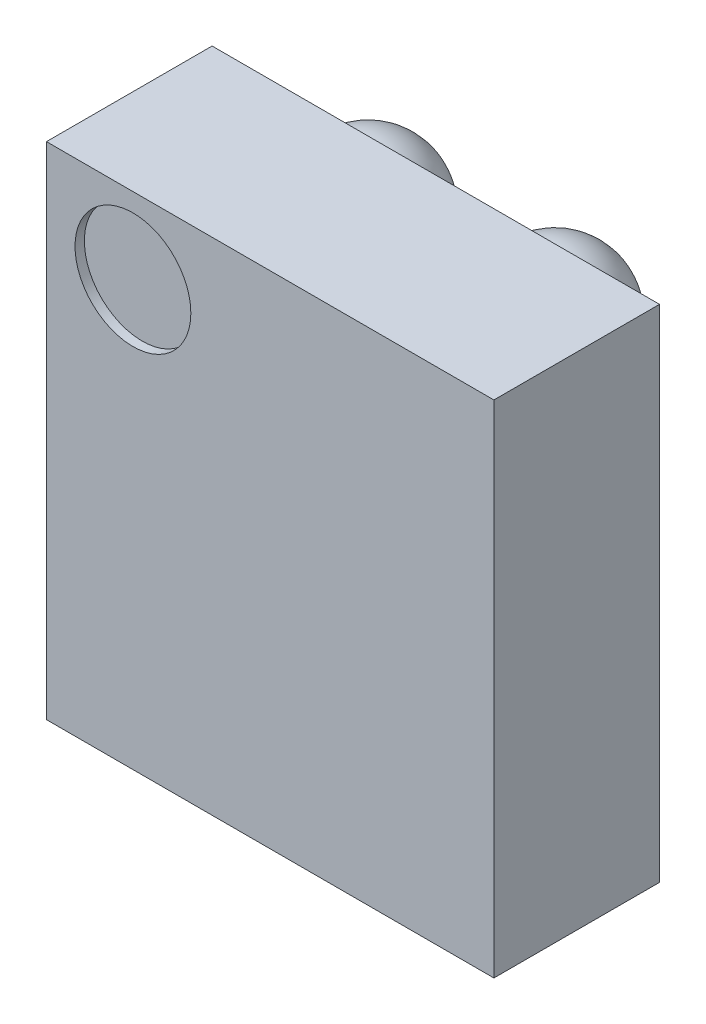
ISO-10303-21;
HEADER;
FILE_DESCRIPTION(('STEP AP214'),'2;1');
FILE_NAME('part.step','',(''),(''),'','','');
FILE_SCHEMA(('AUTOMOTIVE_DESIGN { 1 0 10303 214 1 1 1 1 }'));
ENDSEC;
DATA;
#1=APPLICATION_CONTEXT('core data for automotive mechanical design processes');
#2=APPLICATION_PROTOCOL_DEFINITION('international standard','automotive_design',2000,#1);
#3=PRODUCT_CONTEXT('',#1,'mechanical');
#4=PRODUCT('Part','Part','',(#3));
#5=PRODUCT_RELATED_PRODUCT_CATEGORY('part','',(#4));
#6=PRODUCT_DEFINITION_FORMATION('','',#4);
#7=PRODUCT_DEFINITION_CONTEXT('part definition',#1,'design');
#8=PRODUCT_DEFINITION('design','',#6,#7);
#9=PRODUCT_DEFINITION_SHAPE('','',#8);
#10=(LENGTH_UNIT() NAMED_UNIT(*) SI_UNIT(.MILLI.,.METRE.));
#11=(NAMED_UNIT(*) PLANE_ANGLE_UNIT() SI_UNIT($,.RADIAN.));
#12=(NAMED_UNIT(*) SI_UNIT($,.STERADIAN.) SOLID_ANGLE_UNIT());
#13=UNCERTAINTY_MEASURE_WITH_UNIT(LENGTH_MEASURE(1.E-05),#10,'distance_accuracy_value','');
#14=(GEOMETRIC_REPRESENTATION_CONTEXT(3) GLOBAL_UNCERTAINTY_ASSIGNED_CONTEXT((#13)) GLOBAL_UNIT_ASSIGNED_CONTEXT((#10,
#11,#12)) REPRESENTATION_CONTEXT('',''));
#15=CARTESIAN_POINT('',(0.,0.,0.));
#16=DIRECTION('',(0.,0.,1.));
#17=DIRECTION('',(1.,0.,0.));
#18=AXIS2_PLACEMENT_3D('',#15,#16,#17);
#19=CARTESIAN_POINT('',(-0.2,-0.3465,0.135));
#20=DIRECTION('',(0.,0.,-1.));
#21=DIRECTION('',(1.,0.,0.));
#22=AXIS2_PLACEMENT_3D('',#19,#20,#21);
#23=SPHERICAL_SURFACE('',#22,0.135);
#24=CARTESIAN_POINT('',(-0.2,-0.3465,0.19));
#25=DIRECTION('',(0.,0.,-1.));
#26=DIRECTION('',(-1.,0.,0.));
#27=AXIS2_PLACEMENT_3D('',#24,#25,#26);
#28=CIRCLE('',#27,0.12328828005938);
#29=CARTESIAN_POINT('',(-0.32328828005938,-0.3465,0.19));
#30=VERTEX_POINT('',#29);
#31=EDGE_CURVE('E11',#30,#30,#28,.F.);
#32=ORIENTED_EDGE('',*,*,#31,.F.);
#33=EDGE_LOOP('',(#32));
#34=FACE_BOUND('',#33,.T.);
#35=ADVANCED_FACE('F43',(#34),#23,.T.);
#36=CARTESIAN_POINT('',(-0.2,0.3465,0.135));
#37=DIRECTION('',(0.,0.,-1.));
#38=DIRECTION('',(1.,0.,0.));
#39=AXIS2_PLACEMENT_3D('',#36,#37,#38);
#40=SPHERICAL_SURFACE('',#39,0.135);
#41=CARTESIAN_POINT('',(-0.2,0.3465,0.19));
#42=DIRECTION('',(0.,0.,-1.));
#43=DIRECTION('',(-1.,0.,0.));
#44=AXIS2_PLACEMENT_3D('',#41,#42,#43);
#45=CIRCLE('',#44,0.12328828005938);
#46=CARTESIAN_POINT('',(-0.32328828005938,0.3465,0.19));
#47=VERTEX_POINT('',#46);
#48=EDGE_CURVE('E52',#47,#47,#45,.F.);
#49=ORIENTED_EDGE('',*,*,#48,.F.);
#50=EDGE_LOOP('',(#49));
#51=FACE_BOUND('',#50,.T.);
#52=ADVANCED_FACE('F155',(#51),#40,.T.);
#53=CARTESIAN_POINT('',(0.2,-0.3465,0.135));
#54=DIRECTION('',(0.,0.,-1.));
#55=DIRECTION('',(1.,0.,0.));
#56=AXIS2_PLACEMENT_3D('',#53,#54,#55);
#57=SPHERICAL_SURFACE('',#56,0.135);
#58=CARTESIAN_POINT('',(0.2,-0.3465,0.19));
#59=DIRECTION('',(0.,0.,-1.));
#60=DIRECTION('',(-1.,0.,0.));
#61=AXIS2_PLACEMENT_3D('',#58,#59,#60);
#62=CIRCLE('',#61,0.12328828005938);
#63=CARTESIAN_POINT('',(0.0767117199406205,-0.3465,0.19));
#64=VERTEX_POINT('',#63);
#65=EDGE_CURVE('E133',#64,#64,#62,.F.);
#66=ORIENTED_EDGE('',*,*,#65,.F.);
#67=EDGE_LOOP('',(#66));
#68=FACE_BOUND('',#67,.T.);
#69=ADVANCED_FACE('F157',(#68),#57,.T.);
#70=CARTESIAN_POINT('',(-0.4795,-0.5365,0.545));
#71=DIRECTION('',(-1.,0.,0.));
#72=DIRECTION('',(0.,0.,1.));
#73=AXIS2_PLACEMENT_3D('',#70,#71,#72);
#74=PLANE('',#73);
#75=DIRECTION('',(0.,1.,0.));
#76=VECTOR('',#75,1.);
#77=CARTESIAN_POINT('',(-0.4795,-0.5365,0.19));
#78=LINE('',#77,#76);
#79=CARTESIAN_POINT('',(-0.4795,-0.5365,0.19));
#80=VERTEX_POINT('',#79);
#81=CARTESIAN_POINT('',(-0.4795,0.5365,0.19));
#82=VERTEX_POINT('',#81);
#83=EDGE_CURVE('E120',#80,#82,#78,.T.);
#84=ORIENTED_EDGE('',*,*,#83,.F.);
#85=DIRECTION('',(0.,0.,-1.));
#86=VECTOR('',#85,1.);
#87=CARTESIAN_POINT('',(-0.4795,-0.5365,0.545));
#88=LINE('',#87,#86);
#89=CARTESIAN_POINT('',(-0.4795,-0.5365,0.545));
#90=VERTEX_POINT('',#89);
#91=EDGE_CURVE('E60',#90,#80,#88,.T.);
#92=ORIENTED_EDGE('',*,*,#91,.F.);
#93=DIRECTION('',(0.,1.,0.));
#94=VECTOR('',#93,1.);
#95=CARTESIAN_POINT('',(-0.4795,-0.5365,0.545));
#96=LINE('',#95,#94);
#97=CARTESIAN_POINT('',(-0.4795,0.5365,0.545));
#98=VERTEX_POINT('',#97);
#99=EDGE_CURVE('E110',#90,#98,#96,.T.);
#100=ORIENTED_EDGE('',*,*,#99,.T.);
#101=DIRECTION('',(0.,0.,-1.));
#102=VECTOR('',#101,1.);
#103=CARTESIAN_POINT('',(-0.4795,0.5365,0.545));
#104=LINE('',#103,#102);
#105=EDGE_CURVE('E85',#98,#82,#104,.T.);
#106=ORIENTED_EDGE('',*,*,#105,.T.);
#107=EDGE_LOOP('',(#84,#92,#100,#106));
#108=FACE_BOUND('',#107,.T.);
#109=ADVANCED_FACE('F162',(#108),#74,.T.);
#110=CARTESIAN_POINT('',(-0.4795,-0.5365,0.545));
#111=DIRECTION('',(0.,1.,0.));
#112=DIRECTION('',(0.,0.,1.));
#113=AXIS2_PLACEMENT_3D('',#110,#111,#112);
#114=PLANE('',#113);
#115=DIRECTION('',(1.,0.,0.));
#116=VECTOR('',#115,1.);
#117=CARTESIAN_POINT('',(-0.4795,-0.5365,0.19));
#118=LINE('',#117,#116);
#119=CARTESIAN_POINT('',(0.4795,-0.5365,0.19));
#120=VERTEX_POINT('',#119);
#121=EDGE_CURVE('E77',#80,#120,#118,.T.);
#122=ORIENTED_EDGE('',*,*,#121,.T.);
#123=DIRECTION('',(0.,0.,-1.));
#124=VECTOR('',#123,1.);
#125=CARTESIAN_POINT('',(0.4795,-0.5365,0.545));
#126=LINE('',#125,#124);
#127=CARTESIAN_POINT('',(0.4795,-0.5365,0.545));
#128=VERTEX_POINT('',#127);
#129=EDGE_CURVE('E106',#128,#120,#126,.T.);
#130=ORIENTED_EDGE('',*,*,#129,.F.);
#131=DIRECTION('',(1.,0.,0.));
#132=VECTOR('',#131,1.);
#133=CARTESIAN_POINT('',(-0.4795,-0.5365,0.545));
#134=LINE('',#133,#132);
#135=EDGE_CURVE('E95',#90,#128,#134,.T.);
#136=ORIENTED_EDGE('',*,*,#135,.F.);
#137=ORIENTED_EDGE('',*,*,#91,.T.);
#138=EDGE_LOOP('',(#122,#130,#136,#137));
#139=FACE_BOUND('',#138,.T.);
#140=ADVANCED_FACE('F169',(#139),#114,.F.);
#141=CARTESIAN_POINT('',(0.4795,-0.5365,0.545));
#142=DIRECTION('',(-1.,0.,0.));
#143=DIRECTION('',(0.,0.,1.));
#144=AXIS2_PLACEMENT_3D('',#141,#142,#143);
#145=PLANE('',#144);
#146=DIRECTION('',(0.,1.,0.));
#147=VECTOR('',#146,1.);
#148=CARTESIAN_POINT('',(0.4795,-0.5365,0.19));
#149=LINE('',#148,#147);
#150=CARTESIAN_POINT('',(0.4795,0.5365,0.19));
#151=VERTEX_POINT('',#150);
#152=EDGE_CURVE('E103',#120,#151,#149,.T.);
#153=ORIENTED_EDGE('',*,*,#152,.T.);
#154=DIRECTION('',(0.,0.,-1.));
#155=VECTOR('',#154,1.);
#156=CARTESIAN_POINT('',(0.4795,0.5365,0.545));
#157=LINE('',#156,#155);
#158=CARTESIAN_POINT('',(0.4795,0.5365,0.545));
#159=VERTEX_POINT('',#158);
#160=EDGE_CURVE('E100',#159,#151,#157,.T.);
#161=ORIENTED_EDGE('',*,*,#160,.F.);
#162=DIRECTION('',(0.,1.,0.));
#163=VECTOR('',#162,1.);
#164=CARTESIAN_POINT('',(0.4795,-0.5365,0.545));
#165=LINE('',#164,#163);
#166=EDGE_CURVE('E90',#128,#159,#165,.T.);
#167=ORIENTED_EDGE('',*,*,#166,.F.);
#168=ORIENTED_EDGE('',*,*,#129,.T.);
#169=EDGE_LOOP('',(#153,#161,#167,#168));
#170=FACE_BOUND('',#169,.T.);
#171=ADVANCED_FACE('F101',(#170),#145,.F.);
#172=CARTESIAN_POINT('',(-0.4795,0.5365,0.545));
#173=DIRECTION('',(0.,1.,0.));
#174=DIRECTION('',(0.,0.,1.));
#175=AXIS2_PLACEMENT_3D('',#172,#173,#174);
#176=PLANE('',#175);
#177=DIRECTION('',(1.,0.,0.));
#178=VECTOR('',#177,1.);
#179=CARTESIAN_POINT('',(-0.4795,0.5365,0.19));
#180=LINE('',#179,#178);
#181=EDGE_CURVE('E124',#82,#151,#180,.T.);
#182=ORIENTED_EDGE('',*,*,#181,.F.);
#183=ORIENTED_EDGE('',*,*,#105,.F.);
#184=DIRECTION('',(1.,0.,0.));
#185=VECTOR('',#184,1.);
#186=CARTESIAN_POINT('',(-0.4795,0.5365,0.545));
#187=LINE('',#186,#185);
#188=EDGE_CURVE('E94',#98,#159,#187,.T.);
#189=ORIENTED_EDGE('',*,*,#188,.T.);
#190=ORIENTED_EDGE('',*,*,#160,.T.);
#191=EDGE_LOOP('',(#182,#183,#189,#190));
#192=FACE_BOUND('',#191,.T.);
#193=ADVANCED_FACE('F108',(#192),#176,.T.);
#194=CARTESIAN_POINT('',(0.,0.,0.545));
#195=DIRECTION('',(0.,0.,-1.));
#196=DIRECTION('',(-1.,0.,0.));
#197=AXIS2_PLACEMENT_3D('',#194,#195,#196);
#198=PLANE('',#197);
#199=CARTESIAN_POINT('',(-0.294168663259597,0.372880621938521,0.545));
#200=DIRECTION('',(0.,0.,1.));
#201=DIRECTION('',(1.,0.,0.));
#202=AXIS2_PLACEMENT_3D('',#199,#200,#201);
#203=CIRCLE('',#202,0.124110003592202);
#204=CARTESIAN_POINT('',(-0.170058659667395,0.372880621938521,0.545));
#205=VERTEX_POINT('',#204);
#206=EDGE_CURVE('E201',#205,#205,#203,.T.);
#207=ORIENTED_EDGE('',*,*,#206,.F.);
#208=EDGE_LOOP('',(#207));
#209=FACE_BOUND('',#208,.T.);
#210=ORIENTED_EDGE('',*,*,#99,.F.);
#211=ORIENTED_EDGE('',*,*,#135,.T.);
#212=ORIENTED_EDGE('',*,*,#166,.T.);
#213=ORIENTED_EDGE('',*,*,#188,.F.);
#214=EDGE_LOOP('',(#210,#211,#212,#213));
#215=FACE_BOUND('',#214,.T.);
#216=ADVANCED_FACE('F93',(#209,#215),#198,.F.);
#217=CARTESIAN_POINT('',(0.,0.,0.19));
#218=DIRECTION('',(0.,0.,-1.));
#219=DIRECTION('',(-1.,0.,0.));
#220=AXIS2_PLACEMENT_3D('',#217,#218,#219);
#221=PLANE('',#220);
#222=ORIENTED_EDGE('',*,*,#31,.T.);
#223=EDGE_LOOP('',(#222));
#224=FACE_BOUND('',#223,.T.);
#225=ORIENTED_EDGE('',*,*,#48,.T.);
#226=EDGE_LOOP('',(#225));
#227=FACE_BOUND('',#226,.T.);
#228=ORIENTED_EDGE('',*,*,#65,.T.);
#229=EDGE_LOOP('',(#228));
#230=FACE_BOUND('',#229,.T.);
#231=CARTESIAN_POINT('',(0.2,0.3465,0.19));
#232=DIRECTION('',(0.,0.,-1.));
#233=DIRECTION('',(-1.,0.,0.));
#234=AXIS2_PLACEMENT_3D('',#231,#232,#233);
#235=CIRCLE('',#234,0.12328828005938);
#236=CARTESIAN_POINT('',(0.0767117199406205,0.3465,0.19));
#237=VERTEX_POINT('',#236);
#238=EDGE_CURVE('E141',#237,#237,#235,.F.);
#239=ORIENTED_EDGE('',*,*,#238,.T.);
#240=EDGE_LOOP('',(#239));
#241=FACE_BOUND('',#240,.T.);
#242=CARTESIAN_POINT('',(0.,0.,0.19));
#243=DIRECTION('',(0.,0.,-1.));
#244=DIRECTION('',(-1.,0.,0.));
#245=AXIS2_PLACEMENT_3D('',#242,#243,#244);
#246=CIRCLE('',#245,0.12328828005938);
#247=CARTESIAN_POINT('',(-0.12328828005938,0.,0.19));
#248=VERTEX_POINT('',#247);
#249=EDGE_CURVE('E125',#248,#248,#246,.F.);
#250=ORIENTED_EDGE('',*,*,#249,.T.);
#251=EDGE_LOOP('',(#250));
#252=FACE_BOUND('',#251,.T.);
#253=ORIENTED_EDGE('',*,*,#83,.T.);
#254=ORIENTED_EDGE('',*,*,#181,.T.);
#255=ORIENTED_EDGE('',*,*,#152,.F.);
#256=ORIENTED_EDGE('',*,*,#121,.F.);
#257=EDGE_LOOP('',(#253,#254,#255,#256));
#258=FACE_BOUND('',#257,.T.);
#259=ADVANCED_FACE('F152',(#224,#227,#230,#241,#252,#258),#221,.T.);
#260=CARTESIAN_POINT('',(0.,0.,0.135));
#261=DIRECTION('',(0.,0.,-1.));
#262=DIRECTION('',(1.,0.,0.));
#263=AXIS2_PLACEMENT_3D('',#260,#261,#262);
#264=SPHERICAL_SURFACE('',#263,0.135);
#265=ORIENTED_EDGE('',*,*,#249,.F.);
#266=EDGE_LOOP('',(#265));
#267=FACE_BOUND('',#266,.T.);
#268=ADVANCED_FACE('F178',(#267),#264,.T.);
#269=CARTESIAN_POINT('',(0.2,0.3465,0.135));
#270=DIRECTION('',(0.,0.,-1.));
#271=DIRECTION('',(1.,0.,0.));
#272=AXIS2_PLACEMENT_3D('',#269,#270,#271);
#273=SPHERICAL_SURFACE('',#272,0.135);
#274=ORIENTED_EDGE('',*,*,#238,.F.);
#275=EDGE_LOOP('',(#274));
#276=FACE_BOUND('',#275,.T.);
#277=ADVANCED_FACE('F185',(#276),#273,.T.);
#278=CARTESIAN_POINT('',(-0.294168663259597,0.372880621938521,0.525));
#279=DIRECTION('',(0.,0.,1.));
#280=DIRECTION('',(1.,0.,0.));
#281=AXIS2_PLACEMENT_3D('',#278,#279,#280);
#282=CYLINDRICAL_SURFACE('',#281,0.124110003592202);
#283=CARTESIAN_POINT('',(-0.294168663259597,0.372880621938521,0.525));
#284=DIRECTION('',(0.,0.,1.));
#285=DIRECTION('',(1.,0.,0.));
#286=AXIS2_PLACEMENT_3D('',#283,#284,#285);
#287=CIRCLE('',#286,0.124110003592202);
#288=CARTESIAN_POINT('',(-0.170058659667395,0.372880621938521,0.525));
#289=VERTEX_POINT('',#288);
#290=EDGE_CURVE('E145',#289,#289,#287,.T.);
#291=ORIENTED_EDGE('',*,*,#290,.F.);
#292=EDGE_LOOP('',(#291));
#293=FACE_BOUND('',#292,.T.);
#294=ORIENTED_EDGE('',*,*,#206,.T.);
#295=EDGE_LOOP('',(#294));
#296=FACE_BOUND('',#295,.T.);
#297=ADVANCED_FACE('F189',(#293,#296),#282,.F.);
#298=CARTESIAN_POINT('',(-0.294168663259597,0.372880621938521,0.525));
#299=DIRECTION('',(0.,0.,1.));
#300=DIRECTION('',(1.,0.,0.));
#301=AXIS2_PLACEMENT_3D('',#298,#299,#300);
#302=PLANE('',#301);
#303=ORIENTED_EDGE('',*,*,#290,.T.);
#304=EDGE_LOOP('',(#303));
#305=FACE_BOUND('',#304,.T.);
#306=ADVANCED_FACE('F193',(#305),#302,.T.);
#307=CLOSED_SHELL('',(#35,#52,#69,#109,#140,#171,#193,#216,#259,#268,#277,#297,#306));
#308=MANIFOLD_SOLID_BREP('B2',#307);
#309=ADVANCED_BREP_SHAPE_REPRESENTATION('',(#18,#308),#14);
#310=SHAPE_DEFINITION_REPRESENTATION(#9,#309);
ENDSEC;
END-ISO-10303-21;
